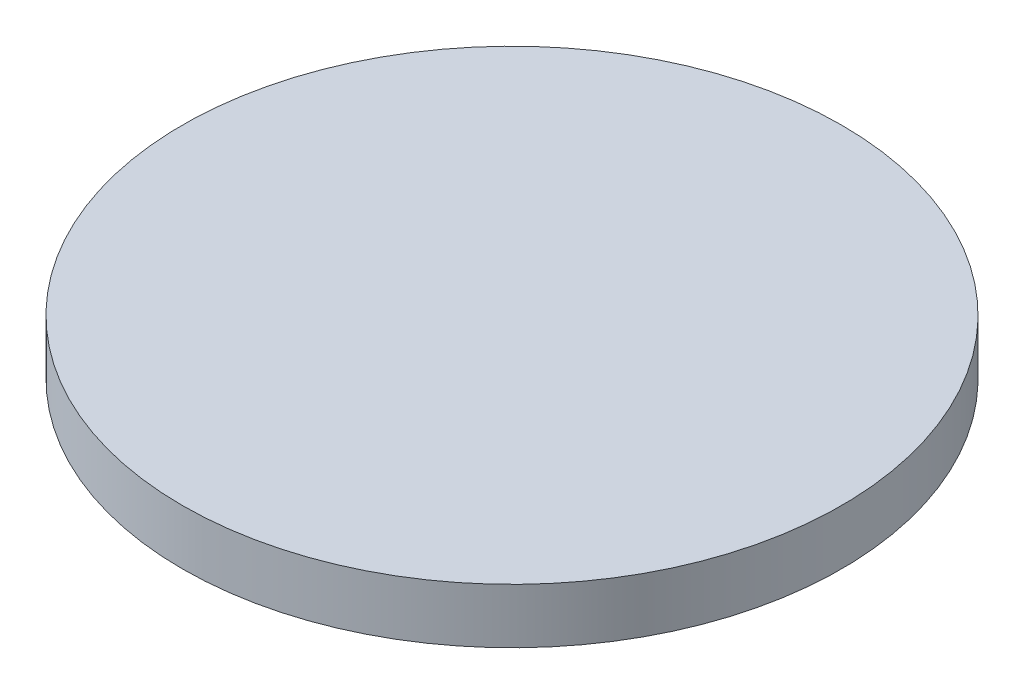
ISO-10303-21;
HEADER;
FILE_DESCRIPTION(('STEP AP214'),'2;1');
FILE_NAME('part.step','',(''),(''),'','','');
FILE_SCHEMA(('AUTOMOTIVE_DESIGN { 1 0 10303 214 1 1 1 1 }'));
ENDSEC;
DATA;
#1=APPLICATION_CONTEXT('core data for automotive mechanical design processes');
#2=APPLICATION_PROTOCOL_DEFINITION('international standard','automotive_design',2000,#1);
#3=PRODUCT_CONTEXT('',#1,'mechanical');
#4=PRODUCT('Part','Part','',(#3));
#5=PRODUCT_RELATED_PRODUCT_CATEGORY('part','',(#4));
#6=PRODUCT_DEFINITION_FORMATION('','',#4);
#7=PRODUCT_DEFINITION_CONTEXT('part definition',#1,'design');
#8=PRODUCT_DEFINITION('design','',#6,#7);
#9=PRODUCT_DEFINITION_SHAPE('','',#8);
#10=(LENGTH_UNIT() NAMED_UNIT(*) SI_UNIT(.MILLI.,.METRE.));
#11=(NAMED_UNIT(*) PLANE_ANGLE_UNIT() SI_UNIT($,.RADIAN.));
#12=(NAMED_UNIT(*) SI_UNIT($,.STERADIAN.) SOLID_ANGLE_UNIT());
#13=UNCERTAINTY_MEASURE_WITH_UNIT(LENGTH_MEASURE(1.E-05),#10,'distance_accuracy_value','');
#14=(GEOMETRIC_REPRESENTATION_CONTEXT(3) GLOBAL_UNCERTAINTY_ASSIGNED_CONTEXT((#13)) GLOBAL_UNIT_ASSIGNED_CONTEXT((#10,
#11,#12)) REPRESENTATION_CONTEXT('',''));
#15=CARTESIAN_POINT('',(0.,0.,0.));
#16=DIRECTION('',(0.,0.,1.));
#17=DIRECTION('',(1.,0.,0.));
#18=AXIS2_PLACEMENT_3D('',#15,#16,#17);
#19=CARTESIAN_POINT('',(0.,12.7,0.));
#20=DIRECTION('',(0.,-1.,0.));
#21=DIRECTION('',(0.,0.,-1.));
#22=AXIS2_PLACEMENT_3D('',#19,#20,#21);
#23=CYLINDRICAL_SURFACE('',#22,76.2);
#24=CARTESIAN_POINT('',(0.,12.7,0.));
#25=DIRECTION('',(0.,1.,0.));
#26=DIRECTION('',(0.,0.,1.));
#27=AXIS2_PLACEMENT_3D('',#24,#25,#26);
#28=CIRCLE('',#27,76.2);
#29=CARTESIAN_POINT('',(0.,12.7,76.2));
#30=VERTEX_POINT('',#29);
#31=EDGE_CURVE('E10',#30,#30,#28,.T.);
#32=ORIENTED_EDGE('',*,*,#31,.F.);
#33=EDGE_LOOP('',(#32));
#34=FACE_BOUND('',#33,.T.);
#35=CARTESIAN_POINT('',(0.,0.,0.));
#36=DIRECTION('',(0.,1.,0.));
#37=DIRECTION('',(0.,0.,1.));
#38=AXIS2_PLACEMENT_3D('',#35,#36,#37);
#39=CIRCLE('',#38,76.2);
#40=CARTESIAN_POINT('',(0.,0.,76.2));
#41=VERTEX_POINT('',#40);
#42=EDGE_CURVE('E38',#41,#41,#39,.T.);
#43=ORIENTED_EDGE('',*,*,#42,.T.);
#44=EDGE_LOOP('',(#43));
#45=FACE_BOUND('',#44,.T.);
#46=ADVANCED_FACE('F35',(#34,#45),#23,.T.);
#47=CARTESIAN_POINT('',(0.,12.7,0.));
#48=DIRECTION('',(0.,1.,0.));
#49=DIRECTION('',(0.,0.,1.));
#50=AXIS2_PLACEMENT_3D('',#47,#48,#49);
#51=PLANE('',#50);
#52=ORIENTED_EDGE('',*,*,#31,.T.);
#53=EDGE_LOOP('',(#52));
#54=FACE_BOUND('',#53,.T.);
#55=ADVANCED_FACE('F50',(#54),#51,.T.);
#56=CARTESIAN_POINT('',(0.,0.,0.));
#57=DIRECTION('',(0.,1.,0.));
#58=DIRECTION('',(0.,0.,1.));
#59=AXIS2_PLACEMENT_3D('',#56,#57,#58);
#60=PLANE('',#59);
#61=ORIENTED_EDGE('',*,*,#42,.F.);
#62=EDGE_LOOP('',(#61));
#63=FACE_BOUND('',#62,.T.);
#64=ADVANCED_FACE('F48',(#63),#60,.F.);
#65=CLOSED_SHELL('',(#46,#55,#64));
#66=MANIFOLD_SOLID_BREP('B2',#65);
#67=ADVANCED_BREP_SHAPE_REPRESENTATION('',(#18,#66),#14);
#68=SHAPE_DEFINITION_REPRESENTATION(#9,#67);
ENDSEC;
END-ISO-10303-21;
